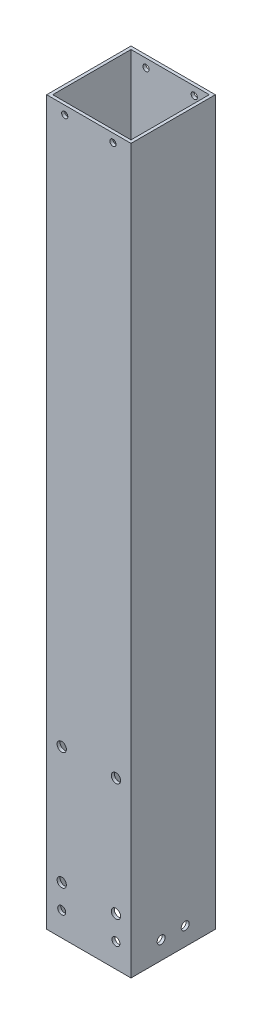
ISO-10303-21;
HEADER;
FILE_DESCRIPTION(('STEP AP214'),'2;1');
FILE_NAME('part.step','',(''),(''),'','','');
FILE_SCHEMA(('AUTOMOTIVE_DESIGN { 1 0 10303 214 1 1 1 1 }'));
ENDSEC;
DATA;
#1=APPLICATION_CONTEXT('core data for automotive mechanical design processes');
#2=APPLICATION_PROTOCOL_DEFINITION('international standard','automotive_design',2000,#1);
#3=PRODUCT_CONTEXT('',#1,'mechanical');
#4=PRODUCT('Part','Part','',(#3));
#5=PRODUCT_RELATED_PRODUCT_CATEGORY('part','',(#4));
#6=PRODUCT_DEFINITION_FORMATION('','',#4);
#7=PRODUCT_DEFINITION_CONTEXT('part definition',#1,'design');
#8=PRODUCT_DEFINITION('design','',#6,#7);
#9=PRODUCT_DEFINITION_SHAPE('','',#8);
#10=(LENGTH_UNIT() NAMED_UNIT(*) SI_UNIT(.MILLI.,.METRE.));
#11=(NAMED_UNIT(*) PLANE_ANGLE_UNIT() SI_UNIT($,.RADIAN.));
#12=(NAMED_UNIT(*) SI_UNIT($,.STERADIAN.) SOLID_ANGLE_UNIT());
#13=UNCERTAINTY_MEASURE_WITH_UNIT(LENGTH_MEASURE(1.E-05),#10,'distance_accuracy_value','');
#14=(GEOMETRIC_REPRESENTATION_CONTEXT(3) GLOBAL_UNCERTAINTY_ASSIGNED_CONTEXT((#13)) GLOBAL_UNIT_ASSIGNED_CONTEXT((#10,
#11,#12)) REPRESENTATION_CONTEXT('',''));
#15=CARTESIAN_POINT('',(0.,0.,0.));
#16=DIRECTION('',(0.,0.,1.));
#17=DIRECTION('',(1.,0.,0.));
#18=AXIS2_PLACEMENT_3D('',#15,#16,#17);
#19=CARTESIAN_POINT('',(0.,0.,0.));
#20=DIRECTION('',(0.,-1.,0.));
#21=DIRECTION('',(0.,0.,-1.));
#22=AXIS2_PLACEMENT_3D('',#19,#20,#21);
#23=PLANE('',#22);
#24=DIRECTION('',(-1.,0.,0.));
#25=VECTOR('',#24,1.);
#26=CARTESIAN_POINT('',(41.275,0.,-41.275));
#27=LINE('',#26,#25);
#28=CARTESIAN_POINT('',(41.275,0.,-41.275));
#29=VERTEX_POINT('',#28);
#30=CARTESIAN_POINT('',(7.78775142451272,0.,-41.275));
#31=VERTEX_POINT('',#30);
#32=EDGE_CURVE('E135',#29,#31,#27,.T.);
#33=ORIENTED_EDGE('',*,*,#32,.T.);
#34=DIRECTION('',(0.,0.,-1.));
#35=VECTOR('',#34,1.);
#36=CARTESIAN_POINT('',(7.78775142451273,0.,44.451));
#37=LINE('',#36,#35);
#38=CARTESIAN_POINT('',(7.78775142451272,0.,-44.45));
#39=VERTEX_POINT('',#38);
#40=EDGE_CURVE('E59',#31,#39,#37,.T.);
#41=ORIENTED_EDGE('',*,*,#40,.T.);
#42=DIRECTION('',(-1.,0.,0.));
#43=VECTOR('',#42,1.);
#44=CARTESIAN_POINT('',(44.45,0.,-44.45));
#45=LINE('',#44,#43);
#46=CARTESIAN_POINT('',(44.45,0.,-44.45));
#47=VERTEX_POINT('',#46);
#48=EDGE_CURVE('E133',#47,#39,#45,.T.);
#49=ORIENTED_EDGE('',*,*,#48,.F.);
#50=DIRECTION('',(0.,0.,-1.));
#51=VECTOR('',#50,1.);
#52=CARTESIAN_POINT('',(44.45,0.,-44.45));
#53=LINE('',#52,#51);
#54=CARTESIAN_POINT('',(44.45,0.,44.45));
#55=VERTEX_POINT('',#54);
#56=EDGE_CURVE('E149',#55,#47,#53,.T.);
#57=ORIENTED_EDGE('',*,*,#56,.F.);
#58=DIRECTION('',(1.,0.,0.));
#59=VECTOR('',#58,1.);
#60=CARTESIAN_POINT('',(44.45,0.,44.45));
#61=LINE('',#60,#59);
#62=CARTESIAN_POINT('',(-44.45,0.,44.45));
#63=VERTEX_POINT('',#62);
#64=EDGE_CURVE('E312',#63,#55,#61,.T.);
#65=ORIENTED_EDGE('',*,*,#64,.F.);
#66=DIRECTION('',(0.,0.,1.));
#67=VECTOR('',#66,1.);
#68=CARTESIAN_POINT('',(-44.45,0.,-44.45));
#69=LINE('',#68,#67);
#70=CARTESIAN_POINT('',(-44.45,0.,-44.45));
#71=VERTEX_POINT('',#70);
#72=EDGE_CURVE('E305',#71,#63,#69,.T.);
#73=ORIENTED_EDGE('',*,*,#72,.F.);
#74=CARTESIAN_POINT('',(-7.78775142451273,0.,-44.45));
#75=VERTEX_POINT('',#74);
#76=EDGE_CURVE('E144',#75,#71,#45,.T.);
#77=ORIENTED_EDGE('',*,*,#76,.F.);
#78=DIRECTION('',(0.,0.,-1.));
#79=VECTOR('',#78,1.);
#80=CARTESIAN_POINT('',(-7.78775142451272,0.,44.451));
#81=LINE('',#80,#79);
#82=CARTESIAN_POINT('',(-7.78775142451273,0.,-41.275));
#83=VERTEX_POINT('',#82);
#84=EDGE_CURVE('E122',#75,#83,#81,.F.);
#85=ORIENTED_EDGE('',*,*,#84,.T.);
#86=CARTESIAN_POINT('',(-41.275,0.,-41.275));
#87=VERTEX_POINT('',#86);
#88=EDGE_CURVE('E296',#83,#87,#27,.T.);
#89=ORIENTED_EDGE('',*,*,#88,.T.);
#90=DIRECTION('',(0.,0.,1.));
#91=VECTOR('',#90,1.);
#92=CARTESIAN_POINT('',(-41.275,0.,41.275));
#93=LINE('',#92,#91);
#94=CARTESIAN_POINT('',(-41.275,0.,41.275));
#95=VERTEX_POINT('',#94);
#96=EDGE_CURVE('E279',#87,#95,#93,.T.);
#97=ORIENTED_EDGE('',*,*,#96,.T.);
#98=DIRECTION('',(1.,0.,0.));
#99=VECTOR('',#98,1.);
#100=CARTESIAN_POINT('',(41.275,0.,41.275));
#101=LINE('',#100,#99);
#102=CARTESIAN_POINT('',(41.275,0.,41.275));
#103=VERTEX_POINT('',#102);
#104=EDGE_CURVE('E291',#95,#103,#101,.T.);
#105=ORIENTED_EDGE('',*,*,#104,.T.);
#106=DIRECTION('',(0.,0.,-1.));
#107=VECTOR('',#106,1.);
#108=CARTESIAN_POINT('',(41.275,0.,41.275));
#109=LINE('',#108,#107);
#110=EDGE_CURVE('E294',#103,#29,#109,.T.);
#111=ORIENTED_EDGE('',*,*,#110,.T.);
#112=EDGE_LOOP('',(#33,#41,#49,#57,#65,#73,#77,#85,#89,#97,#105,#111));
#113=FACE_BOUND('',#112,.T.);
#114=ADVANCED_FACE('F42',(#113),#23,.T.);
#115=CARTESIAN_POINT('',(44.45,762.,-44.45));
#116=DIRECTION('',(0.,0.,1.));
#117=DIRECTION('',(1.,0.,0.));
#118=AXIS2_PLACEMENT_3D('',#115,#116,#117);
#119=PLANE('',#118);
#120=CARTESIAN_POINT('',(25.4,753.11,-44.45));
#121=DIRECTION('',(0.,0.,-1.));
#122=DIRECTION('',(-1.,0.,0.));
#123=AXIS2_PLACEMENT_3D('',#120,#121,#122);
#124=CIRCLE('',#123,3.26389999999999);
#125=CARTESIAN_POINT('',(22.1361,753.11,-44.45));
#126=VERTEX_POINT('',#125);
#127=EDGE_CURVE('E660',#126,#126,#124,.T.);
#128=ORIENTED_EDGE('',*,*,#127,.F.);
#129=EDGE_LOOP('',(#128));
#130=FACE_BOUND('',#129,.T.);
#131=CARTESIAN_POINT('',(-25.4,753.11,-44.45));
#132=DIRECTION('',(0.,0.,-1.));
#133=DIRECTION('',(-1.,0.,0.));
#134=AXIS2_PLACEMENT_3D('',#131,#132,#133);
#135=CIRCLE('',#134,3.26389999999999);
#136=CARTESIAN_POINT('',(-28.6639,753.11,-44.45));
#137=VERTEX_POINT('',#136);
#138=EDGE_CURVE('E206',#137,#137,#135,.T.);
#139=ORIENTED_EDGE('',*,*,#138,.F.);
#140=EDGE_LOOP('',(#139));
#141=FACE_BOUND('',#140,.T.);
#142=CARTESIAN_POINT('',(0.,383.9845,-44.45));
#143=DIRECTION('',(0.,0.,-1.));
#144=DIRECTION('',(-1.,0.,0.));
#145=AXIS2_PLACEMENT_3D('',#142,#143,#144);
#146=CIRCLE('',#145,7.93749999999999);
#147=CARTESIAN_POINT('',(-7.9375,383.9845,-44.45));
#148=VERTEX_POINT('',#147);
#149=EDGE_CURVE('E196',#148,#148,#146,.T.);
#150=ORIENTED_EDGE('',*,*,#149,.F.);
#151=EDGE_LOOP('',(#150));
#152=FACE_BOUND('',#151,.T.);
#153=CARTESIAN_POINT('',(28.575,50.8,-44.45));
#154=DIRECTION('',(0.,0.,-1.));
#155=DIRECTION('',(-1.,0.,0.));
#156=AXIS2_PLACEMENT_3D('',#153,#154,#155);
#157=CIRCLE('',#156,4.90219999999999);
#158=CARTESIAN_POINT('',(23.6728,50.8,-44.45));
#159=VERTEX_POINT('',#158);
#160=EDGE_CURVE('E195',#159,#159,#157,.T.);
#161=ORIENTED_EDGE('',*,*,#160,.F.);
#162=EDGE_LOOP('',(#161));
#163=FACE_BOUND('',#162,.T.);
#164=CARTESIAN_POINT('',(-28.575,50.8,-44.45));
#165=DIRECTION('',(0.,0.,-1.));
#166=DIRECTION('',(-1.,0.,0.));
#167=AXIS2_PLACEMENT_3D('',#164,#165,#166);
#168=CIRCLE('',#167,4.90219999999999);
#169=CARTESIAN_POINT('',(-33.4772,50.8,-44.45));
#170=VERTEX_POINT('',#169);
#171=EDGE_CURVE('E223',#170,#170,#168,.T.);
#172=ORIENTED_EDGE('',*,*,#171,.F.);
#173=EDGE_LOOP('',(#172));
#174=FACE_BOUND('',#173,.T.);
#175=CARTESIAN_POINT('',(-28.575,174.625,-44.45));
#176=DIRECTION('',(0.,0.,-1.));
#177=DIRECTION('',(-1.,0.,0.));
#178=AXIS2_PLACEMENT_3D('',#175,#176,#177);
#179=CIRCLE('',#178,4.90219999999999);
#180=CARTESIAN_POINT('',(-33.4772,174.625,-44.45));
#181=VERTEX_POINT('',#180);
#182=EDGE_CURVE('E235',#181,#181,#179,.T.);
#183=ORIENTED_EDGE('',*,*,#182,.F.);
#184=EDGE_LOOP('',(#183));
#185=FACE_BOUND('',#184,.T.);
#186=CARTESIAN_POINT('',(28.575,174.625,-44.45));
#187=DIRECTION('',(0.,0.,-1.));
#188=DIRECTION('',(-1.,0.,0.));
#189=AXIS2_PLACEMENT_3D('',#186,#187,#188);
#190=CIRCLE('',#189,4.90219999999999);
#191=CARTESIAN_POINT('',(23.6728,174.625,-44.45));
#192=VERTEX_POINT('',#191);
#193=EDGE_CURVE('E242',#192,#192,#190,.T.);
#194=ORIENTED_EDGE('',*,*,#193,.F.);
#195=EDGE_LOOP('',(#194));
#196=FACE_BOUND('',#195,.T.);
#197=CARTESIAN_POINT('',(28.575,25.4,-44.45));
#198=DIRECTION('',(0.,0.,1.));
#199=DIRECTION('',(1.,0.,0.));
#200=AXIS2_PLACEMENT_3D('',#197,#198,#199);
#201=CIRCLE('',#200,4.2164);
#202=CARTESIAN_POINT('',(32.7914,25.4,-44.45));
#203=VERTEX_POINT('',#202);
#204=EDGE_CURVE('E264',#203,#203,#201,.T.);
#205=ORIENTED_EDGE('',*,*,#204,.T.);
#206=EDGE_LOOP('',(#205));
#207=FACE_BOUND('',#206,.T.);
#208=CARTESIAN_POINT('',(-28.575,25.4,-44.45));
#209=DIRECTION('',(0.,0.,1.));
#210=DIRECTION('',(1.,0.,0.));
#211=AXIS2_PLACEMENT_3D('',#208,#209,#210);
#212=CIRCLE('',#211,4.2164);
#213=CARTESIAN_POINT('',(-24.3586,25.4,-44.45));
#214=VERTEX_POINT('',#213);
#215=EDGE_CURVE('E164',#214,#214,#212,.T.);
#216=ORIENTED_EDGE('',*,*,#215,.T.);
#217=EDGE_LOOP('',(#216));
#218=FACE_BOUND('',#217,.T.);
#219=CARTESIAN_POINT('',(0.,-2.54,-44.45));
#220=DIRECTION('',(0.,0.,1.));
#221=DIRECTION('',(1.,0.,0.));
#222=AXIS2_PLACEMENT_3D('',#219,#220,#221);
#223=CIRCLE('',#222,8.1915);
#224=EDGE_CURVE('E119',#75,#39,#223,.F.);
#225=ORIENTED_EDGE('',*,*,#224,.F.);
#226=ORIENTED_EDGE('',*,*,#76,.T.);
#227=DIRECTION('',(0.,-1.,0.));
#228=VECTOR('',#227,1.);
#229=CARTESIAN_POINT('',(-44.45,762.,-44.45));
#230=LINE('',#229,#228);
#231=CARTESIAN_POINT('',(-44.45,762.,-44.45));
#232=VERTEX_POINT('',#231);
#233=EDGE_CURVE('E153',#232,#71,#230,.T.);
#234=ORIENTED_EDGE('',*,*,#233,.F.);
#235=DIRECTION('',(-1.,0.,0.));
#236=VECTOR('',#235,1.);
#237=CARTESIAN_POINT('',(44.45,762.,-44.45));
#238=LINE('',#237,#236);
#239=CARTESIAN_POINT('',(44.45,762.,-44.45));
#240=VERTEX_POINT('',#239);
#241=EDGE_CURVE('E156',#240,#232,#238,.T.);
#242=ORIENTED_EDGE('',*,*,#241,.F.);
#243=DIRECTION('',(0.,-1.,0.));
#244=VECTOR('',#243,1.);
#245=CARTESIAN_POINT('',(44.45,762.,-44.45));
#246=LINE('',#245,#244);
#247=EDGE_CURVE('E142',#240,#47,#246,.T.);
#248=ORIENTED_EDGE('',*,*,#247,.T.);
#249=ORIENTED_EDGE('',*,*,#48,.T.);
#250=EDGE_LOOP('',(#225,#226,#234,#242,#248,#249));
#251=FACE_BOUND('',#250,.T.);
#252=ADVANCED_FACE('F139',(#130,#141,#152,#163,#174,#185,#196,#207,#218,#251),#119,.F.);
#253=CARTESIAN_POINT('',(41.275,762.,-41.275));
#254=DIRECTION('',(0.,0.,1.));
#255=DIRECTION('',(1.,0.,0.));
#256=AXIS2_PLACEMENT_3D('',#253,#254,#255);
#257=PLANE('',#256);
#258=CARTESIAN_POINT('',(25.4,753.11,-41.275));
#259=DIRECTION('',(0.,0.,1.));
#260=DIRECTION('',(1.,0.,0.));
#261=AXIS2_PLACEMENT_3D('',#258,#259,#260);
#262=CIRCLE('',#261,3.26389999999998);
#263=CARTESIAN_POINT('',(28.6639,753.11,-41.275));
#264=VERTEX_POINT('',#263);
#265=EDGE_CURVE('E211',#264,#264,#262,.T.);
#266=ORIENTED_EDGE('',*,*,#265,.F.);
#267=EDGE_LOOP('',(#266));
#268=FACE_BOUND('',#267,.T.);
#269=CARTESIAN_POINT('',(-25.4,753.11,-41.275));
#270=DIRECTION('',(0.,0.,1.));
#271=DIRECTION('',(1.,0.,0.));
#272=AXIS2_PLACEMENT_3D('',#269,#270,#271);
#273=CIRCLE('',#272,3.26389999999998);
#274=CARTESIAN_POINT('',(-22.1361,753.11,-41.275));
#275=VERTEX_POINT('',#274);
#276=EDGE_CURVE('E199',#275,#275,#273,.T.);
#277=ORIENTED_EDGE('',*,*,#276,.F.);
#278=EDGE_LOOP('',(#277));
#279=FACE_BOUND('',#278,.T.);
#280=CARTESIAN_POINT('',(0.,383.9845,-41.275));
#281=DIRECTION('',(0.,0.,1.));
#282=DIRECTION('',(1.,0.,0.));
#283=AXIS2_PLACEMENT_3D('',#280,#281,#282);
#284=CIRCLE('',#283,7.93749999999999);
#285=CARTESIAN_POINT('',(7.93749999999999,383.9845,-41.275));
#286=VERTEX_POINT('',#285);
#287=EDGE_CURVE('E193',#286,#286,#284,.T.);
#288=ORIENTED_EDGE('',*,*,#287,.F.);
#289=EDGE_LOOP('',(#288));
#290=FACE_BOUND('',#289,.T.);
#291=CARTESIAN_POINT('',(28.575,50.8,-41.275));
#292=DIRECTION('',(0.,0.,1.));
#293=DIRECTION('',(1.,0.,0.));
#294=AXIS2_PLACEMENT_3D('',#291,#292,#293);
#295=CIRCLE('',#294,4.90219999999998);
#296=CARTESIAN_POINT('',(33.4772,50.8,-41.275));
#297=VERTEX_POINT('',#296);
#298=EDGE_CURVE('E191',#297,#297,#295,.T.);
#299=ORIENTED_EDGE('',*,*,#298,.F.);
#300=EDGE_LOOP('',(#299));
#301=FACE_BOUND('',#300,.T.);
#302=CARTESIAN_POINT('',(-28.575,50.8,-41.275));
#303=DIRECTION('',(0.,0.,1.));
#304=DIRECTION('',(1.,0.,0.));
#305=AXIS2_PLACEMENT_3D('',#302,#303,#304);
#306=CIRCLE('',#305,4.90219999999998);
#307=CARTESIAN_POINT('',(-23.6728,50.8,-41.275));
#308=VERTEX_POINT('',#307);
#309=EDGE_CURVE('E232',#308,#308,#306,.T.);
#310=ORIENTED_EDGE('',*,*,#309,.F.);
#311=EDGE_LOOP('',(#310));
#312=FACE_BOUND('',#311,.T.);
#313=CARTESIAN_POINT('',(-28.575,174.625,-41.275));
#314=DIRECTION('',(0.,0.,1.));
#315=DIRECTION('',(1.,0.,0.));
#316=AXIS2_PLACEMENT_3D('',#313,#314,#315);
#317=CIRCLE('',#316,4.90219999999998);
#318=CARTESIAN_POINT('',(-23.6728,174.625,-41.275));
#319=VERTEX_POINT('',#318);
#320=EDGE_CURVE('E186',#319,#319,#317,.T.);
#321=ORIENTED_EDGE('',*,*,#320,.F.);
#322=EDGE_LOOP('',(#321));
#323=FACE_BOUND('',#322,.T.);
#324=CARTESIAN_POINT('',(28.575,174.625,-41.275));
#325=DIRECTION('',(0.,0.,1.));
#326=DIRECTION('',(1.,0.,0.));
#327=AXIS2_PLACEMENT_3D('',#324,#325,#326);
#328=CIRCLE('',#327,4.90219999999998);
#329=CARTESIAN_POINT('',(33.4772,174.625,-41.275));
#330=VERTEX_POINT('',#329);
#331=EDGE_CURVE('E136',#330,#330,#328,.T.);
#332=ORIENTED_EDGE('',*,*,#331,.F.);
#333=EDGE_LOOP('',(#332));
#334=FACE_BOUND('',#333,.T.);
#335=CARTESIAN_POINT('',(-28.575,25.4,-41.275));
#336=DIRECTION('',(0.,0.,1.));
#337=DIRECTION('',(1.,0.,0.));
#338=AXIS2_PLACEMENT_3D('',#335,#336,#337);
#339=CIRCLE('',#338,4.2164);
#340=CARTESIAN_POINT('',(-24.3586,25.4,-41.275));
#341=VERTEX_POINT('',#340);
#342=EDGE_CURVE('E165',#341,#341,#339,.T.);
#343=ORIENTED_EDGE('',*,*,#342,.F.);
#344=EDGE_LOOP('',(#343));
#345=FACE_BOUND('',#344,.T.);
#346=CARTESIAN_POINT('',(28.575,25.4,-41.275));
#347=DIRECTION('',(0.,0.,1.));
#348=DIRECTION('',(1.,0.,0.));
#349=AXIS2_PLACEMENT_3D('',#346,#347,#348);
#350=CIRCLE('',#349,4.2164);
#351=CARTESIAN_POINT('',(32.7914,25.4,-41.275));
#352=VERTEX_POINT('',#351);
#353=EDGE_CURVE('E160',#352,#352,#350,.T.);
#354=ORIENTED_EDGE('',*,*,#353,.F.);
#355=EDGE_LOOP('',(#354));
#356=FACE_BOUND('',#355,.T.);
#357=ORIENTED_EDGE('',*,*,#88,.F.);
#358=CARTESIAN_POINT('',(0.,-2.54,-41.275));
#359=DIRECTION('',(0.,0.,1.));
#360=DIRECTION('',(1.,0.,0.));
#361=AXIS2_PLACEMENT_3D('',#358,#359,#360);
#362=CIRCLE('',#361,8.1915);
#363=EDGE_CURVE('E127',#83,#31,#362,.F.);
#364=ORIENTED_EDGE('',*,*,#363,.T.);
#365=ORIENTED_EDGE('',*,*,#32,.F.);
#366=DIRECTION('',(0.,-1.,0.));
#367=VECTOR('',#366,1.);
#368=CARTESIAN_POINT('',(41.275,762.,-41.275));
#369=LINE('',#368,#367);
#370=CARTESIAN_POINT('',(41.275,762.,-41.275));
#371=VERTEX_POINT('',#370);
#372=EDGE_CURVE('E67',#371,#29,#369,.T.);
#373=ORIENTED_EDGE('',*,*,#372,.F.);
#374=DIRECTION('',(-1.,0.,0.));
#375=VECTOR('',#374,1.);
#376=CARTESIAN_POINT('',(41.275,762.,-41.275));
#377=LINE('',#376,#375);
#378=CARTESIAN_POINT('',(-41.275,762.,-41.275));
#379=VERTEX_POINT('',#378);
#380=EDGE_CURVE('E286',#371,#379,#377,.T.);
#381=ORIENTED_EDGE('',*,*,#380,.T.);
#382=DIRECTION('',(0.,-1.,0.));
#383=VECTOR('',#382,1.);
#384=CARTESIAN_POINT('',(-41.275,762.,-41.275));
#385=LINE('',#384,#383);
#386=EDGE_CURVE('E288',#379,#87,#385,.T.);
#387=ORIENTED_EDGE('',*,*,#386,.T.);
#388=EDGE_LOOP('',(#357,#364,#365,#373,#381,#387));
#389=FACE_BOUND('',#388,.T.);
#390=ADVANCED_FACE('F326',(#268,#279,#290,#301,#312,#323,#334,#345,#356,#389),#257,.T.);
#391=CARTESIAN_POINT('',(0.,762.,0.));
#392=DIRECTION('',(0.,-1.,0.));
#393=DIRECTION('',(0.,0.,-1.));
#394=AXIS2_PLACEMENT_3D('',#391,#392,#393);
#395=PLANE('',#394);
#396=DIRECTION('',(0.,0.,1.));
#397=VECTOR('',#396,1.);
#398=CARTESIAN_POINT('',(-44.45,762.,-44.45));
#399=LINE('',#398,#397);
#400=CARTESIAN_POINT('',(-44.45,762.,44.45));
#401=VERTEX_POINT('',#400);
#402=EDGE_CURVE('E143',#232,#401,#399,.T.);
#403=ORIENTED_EDGE('',*,*,#402,.T.);
#404=DIRECTION('',(1.,0.,0.));
#405=VECTOR('',#404,1.);
#406=CARTESIAN_POINT('',(44.45,762.,44.45));
#407=LINE('',#406,#405);
#408=CARTESIAN_POINT('',(44.45,762.,44.45));
#409=VERTEX_POINT('',#408);
#410=EDGE_CURVE('E147',#401,#409,#407,.T.);
#411=ORIENTED_EDGE('',*,*,#410,.T.);
#412=DIRECTION('',(0.,0.,-1.));
#413=VECTOR('',#412,1.);
#414=CARTESIAN_POINT('',(44.45,762.,-44.45));
#415=LINE('',#414,#413);
#416=EDGE_CURVE('E308',#409,#240,#415,.T.);
#417=ORIENTED_EDGE('',*,*,#416,.T.);
#418=ORIENTED_EDGE('',*,*,#241,.T.);
#419=EDGE_LOOP('',(#403,#411,#417,#418));
#420=FACE_BOUND('',#419,.T.);
#421=DIRECTION('',(0.,0.,1.));
#422=VECTOR('',#421,1.);
#423=CARTESIAN_POINT('',(-41.275,762.,41.275));
#424=LINE('',#423,#422);
#425=CARTESIAN_POINT('',(-41.275,762.,41.275));
#426=VERTEX_POINT('',#425);
#427=EDGE_CURVE('E280',#379,#426,#424,.T.);
#428=ORIENTED_EDGE('',*,*,#427,.F.);
#429=ORIENTED_EDGE('',*,*,#380,.F.);
#430=DIRECTION('',(0.,0.,-1.));
#431=VECTOR('',#430,1.);
#432=CARTESIAN_POINT('',(41.275,762.,41.275));
#433=LINE('',#432,#431);
#434=CARTESIAN_POINT('',(41.275,762.,41.275));
#435=VERTEX_POINT('',#434);
#436=EDGE_CURVE('E284',#435,#371,#433,.T.);
#437=ORIENTED_EDGE('',*,*,#436,.F.);
#438=DIRECTION('',(1.,0.,0.));
#439=VECTOR('',#438,1.);
#440=CARTESIAN_POINT('',(41.275,762.,41.275));
#441=LINE('',#440,#439);
#442=EDGE_CURVE('E282',#426,#435,#441,.T.);
#443=ORIENTED_EDGE('',*,*,#442,.F.);
#444=EDGE_LOOP('',(#428,#429,#437,#443));
#445=FACE_BOUND('',#444,.T.);
#446=ADVANCED_FACE('F335',(#420,#445),#395,.F.);
#447=CARTESIAN_POINT('',(-44.45,762.,-44.45));
#448=DIRECTION('',(1.,0.,0.));
#449=DIRECTION('',(0.,0.,-1.));
#450=AXIS2_PLACEMENT_3D('',#447,#448,#449);
#451=PLANE('',#450);
#452=CARTESIAN_POINT('',(-44.45,19.05,12.7));
#453=DIRECTION('',(1.,0.,0.));
#454=DIRECTION('',(0.,0.,-1.));
#455=AXIS2_PLACEMENT_3D('',#452,#453,#454);
#456=CIRCLE('',#455,4.21639999999999);
#457=CARTESIAN_POINT('',(-44.45,19.05,8.48360000000001));
#458=VERTEX_POINT('',#457);
#459=EDGE_CURVE('E261',#458,#458,#456,.T.);
#460=ORIENTED_EDGE('',*,*,#459,.T.);
#461=EDGE_LOOP('',(#460));
#462=FACE_BOUND('',#461,.T.);
#463=CARTESIAN_POINT('',(-44.45,19.05,-12.7));
#464=DIRECTION('',(1.,0.,0.));
#465=DIRECTION('',(0.,0.,-1.));
#466=AXIS2_PLACEMENT_3D('',#463,#464,#465);
#467=CIRCLE('',#466,4.21639999999999);
#468=CARTESIAN_POINT('',(-44.45,19.05,-16.9164));
#469=VERTEX_POINT('',#468);
#470=EDGE_CURVE('E178',#469,#469,#467,.T.);
#471=ORIENTED_EDGE('',*,*,#470,.T.);
#472=EDGE_LOOP('',(#471));
#473=FACE_BOUND('',#472,.T.);
#474=ORIENTED_EDGE('',*,*,#72,.T.);
#475=DIRECTION('',(0.,-1.,0.));
#476=VECTOR('',#475,1.);
#477=CARTESIAN_POINT('',(-44.45,762.,44.45));
#478=LINE('',#477,#476);
#479=EDGE_CURVE('E11',#401,#63,#478,.T.);
#480=ORIENTED_EDGE('',*,*,#479,.F.);
#481=ORIENTED_EDGE('',*,*,#402,.F.);
#482=ORIENTED_EDGE('',*,*,#233,.T.);
#483=EDGE_LOOP('',(#474,#480,#481,#482));
#484=FACE_BOUND('',#483,.T.);
#485=ADVANCED_FACE('F44',(#462,#473,#484),#451,.F.);
#486=CARTESIAN_POINT('',(44.45,762.,44.45));
#487=DIRECTION('',(0.,0.,-1.));
#488=DIRECTION('',(-1.,0.,0.));
#489=AXIS2_PLACEMENT_3D('',#486,#487,#488);
#490=PLANE('',#489);
#491=CARTESIAN_POINT('',(25.4,753.11,44.45));
#492=DIRECTION('',(0.,0.,-1.));
#493=DIRECTION('',(-1.,0.,0.));
#494=AXIS2_PLACEMENT_3D('',#491,#492,#493);
#495=CIRCLE('',#494,3.26389999999998);
#496=CARTESIAN_POINT('',(22.1361,753.11,44.45));
#497=VERTEX_POINT('',#496);
#498=EDGE_CURVE('E385',#497,#497,#495,.T.);
#499=ORIENTED_EDGE('',*,*,#498,.T.);
#500=EDGE_LOOP('',(#499));
#501=FACE_BOUND('',#500,.T.);
#502=CARTESIAN_POINT('',(-25.4,753.11,44.45));
#503=DIRECTION('',(0.,0.,-1.));
#504=DIRECTION('',(-1.,0.,0.));
#505=AXIS2_PLACEMENT_3D('',#502,#503,#504);
#506=CIRCLE('',#505,3.26389999999998);
#507=CARTESIAN_POINT('',(-28.6639,753.11,44.45));
#508=VERTEX_POINT('',#507);
#509=EDGE_CURVE('E200',#508,#508,#506,.T.);
#510=ORIENTED_EDGE('',*,*,#509,.T.);
#511=EDGE_LOOP('',(#510));
#512=FACE_BOUND('',#511,.T.);
#513=CARTESIAN_POINT('',(28.575,50.8,44.45));
#514=DIRECTION('',(0.,0.,-1.));
#515=DIRECTION('',(-1.,0.,0.));
#516=AXIS2_PLACEMENT_3D('',#513,#514,#515);
#517=CIRCLE('',#516,4.90219999999997);
#518=CARTESIAN_POINT('',(23.6728,50.8,44.45));
#519=VERTEX_POINT('',#518);
#520=EDGE_CURVE('E192',#519,#519,#517,.T.);
#521=ORIENTED_EDGE('',*,*,#520,.T.);
#522=EDGE_LOOP('',(#521));
#523=FACE_BOUND('',#522,.T.);
#524=CARTESIAN_POINT('',(-28.575,50.8,44.45));
#525=DIRECTION('',(0.,0.,-1.));
#526=DIRECTION('',(-1.,0.,0.));
#527=AXIS2_PLACEMENT_3D('',#524,#525,#526);
#528=CIRCLE('',#527,4.90219999999998);
#529=CARTESIAN_POINT('',(-33.4772,50.8,44.45));
#530=VERTEX_POINT('',#529);
#531=EDGE_CURVE('E226',#530,#530,#528,.T.);
#532=ORIENTED_EDGE('',*,*,#531,.T.);
#533=EDGE_LOOP('',(#532));
#534=FACE_BOUND('',#533,.T.);
#535=CARTESIAN_POINT('',(-28.575,174.625,44.45));
#536=DIRECTION('',(0.,0.,-1.));
#537=DIRECTION('',(-1.,0.,0.));
#538=AXIS2_PLACEMENT_3D('',#535,#536,#537);
#539=CIRCLE('',#538,4.90219999999998);
#540=CARTESIAN_POINT('',(-33.4772,174.625,44.45));
#541=VERTEX_POINT('',#540);
#542=EDGE_CURVE('E187',#541,#541,#539,.T.);
#543=ORIENTED_EDGE('',*,*,#542,.T.);
#544=EDGE_LOOP('',(#543));
#545=FACE_BOUND('',#544,.T.);
#546=CARTESIAN_POINT('',(28.575,174.625,44.45));
#547=DIRECTION('',(0.,0.,-1.));
#548=DIRECTION('',(-1.,0.,0.));
#549=AXIS2_PLACEMENT_3D('',#546,#547,#548);
#550=CIRCLE('',#549,4.90219999999997);
#551=CARTESIAN_POINT('',(23.6728,174.625,44.45));
#552=VERTEX_POINT('',#551);
#553=EDGE_CURVE('E182',#552,#552,#550,.T.);
#554=ORIENTED_EDGE('',*,*,#553,.T.);
#555=EDGE_LOOP('',(#554));
#556=FACE_BOUND('',#555,.T.);
#557=CARTESIAN_POINT('',(-28.575,25.4,44.45));
#558=DIRECTION('',(0.,0.,1.));
#559=DIRECTION('',(1.,0.,0.));
#560=AXIS2_PLACEMENT_3D('',#557,#558,#559);
#561=CIRCLE('',#560,4.2164);
#562=CARTESIAN_POINT('',(-24.3586,25.4,44.45));
#563=VERTEX_POINT('',#562);
#564=EDGE_CURVE('E265',#563,#563,#561,.T.);
#565=ORIENTED_EDGE('',*,*,#564,.F.);
#566=EDGE_LOOP('',(#565));
#567=FACE_BOUND('',#566,.T.);
#568=CARTESIAN_POINT('',(28.575,25.4,44.45));
#569=DIRECTION('',(0.,0.,1.));
#570=DIRECTION('',(1.,0.,0.));
#571=AXIS2_PLACEMENT_3D('',#568,#569,#570);
#572=CIRCLE('',#571,4.2164);
#573=CARTESIAN_POINT('',(32.7914,25.4,44.45));
#574=VERTEX_POINT('',#573);
#575=EDGE_CURVE('E268',#574,#574,#572,.T.);
#576=ORIENTED_EDGE('',*,*,#575,.F.);
#577=EDGE_LOOP('',(#576));
#578=FACE_BOUND('',#577,.T.);
#579=ORIENTED_EDGE('',*,*,#64,.T.);
#580=DIRECTION('',(0.,-1.,0.));
#581=VECTOR('',#580,1.);
#582=CARTESIAN_POINT('',(44.45,762.,44.45));
#583=LINE('',#582,#581);
#584=EDGE_CURVE('E51',#409,#55,#583,.T.);
#585=ORIENTED_EDGE('',*,*,#584,.F.);
#586=ORIENTED_EDGE('',*,*,#410,.F.);
#587=ORIENTED_EDGE('',*,*,#479,.T.);
#588=EDGE_LOOP('',(#579,#585,#586,#587));
#589=FACE_BOUND('',#588,.T.);
#590=ADVANCED_FACE('F320',(#501,#512,#523,#534,#545,#556,#567,#578,#589),#490,.F.);
#591=CARTESIAN_POINT('',(44.45,762.,-44.45));
#592=DIRECTION('',(-1.,0.,0.));
#593=DIRECTION('',(0.,0.,1.));
#594=AXIS2_PLACEMENT_3D('',#591,#592,#593);
#595=PLANE('',#594);
#596=CARTESIAN_POINT('',(44.45,19.05,12.7));
#597=DIRECTION('',(-1.,0.,0.));
#598=DIRECTION('',(0.,0.,1.));
#599=AXIS2_PLACEMENT_3D('',#596,#597,#598);
#600=CIRCLE('',#599,4.21639999999999);
#601=CARTESIAN_POINT('',(44.45,19.05,16.9164));
#602=VERTEX_POINT('',#601);
#603=EDGE_CURVE('E173',#602,#602,#600,.T.);
#604=ORIENTED_EDGE('',*,*,#603,.T.);
#605=EDGE_LOOP('',(#604));
#606=FACE_BOUND('',#605,.T.);
#607=CARTESIAN_POINT('',(44.45,19.05,-12.7));
#608=DIRECTION('',(-1.,0.,0.));
#609=DIRECTION('',(0.,0.,1.));
#610=AXIS2_PLACEMENT_3D('',#607,#608,#609);
#611=CIRCLE('',#610,4.21639999999999);
#612=CARTESIAN_POINT('',(44.45,19.05,-8.48360000000001));
#613=VERTEX_POINT('',#612);
#614=EDGE_CURVE('E126',#613,#613,#611,.T.);
#615=ORIENTED_EDGE('',*,*,#614,.T.);
#616=EDGE_LOOP('',(#615));
#617=FACE_BOUND('',#616,.T.);
#618=ORIENTED_EDGE('',*,*,#56,.T.);
#619=ORIENTED_EDGE('',*,*,#247,.F.);
#620=ORIENTED_EDGE('',*,*,#416,.F.);
#621=ORIENTED_EDGE('',*,*,#584,.T.);
#622=EDGE_LOOP('',(#618,#619,#620,#621));
#623=FACE_BOUND('',#622,.T.);
#624=ADVANCED_FACE('F316',(#606,#617,#623),#595,.F.);
#625=CARTESIAN_POINT('',(-41.275,762.,41.275));
#626=DIRECTION('',(1.,0.,0.));
#627=DIRECTION('',(0.,0.,-1.));
#628=AXIS2_PLACEMENT_3D('',#625,#626,#627);
#629=PLANE('',#628);
#630=CARTESIAN_POINT('',(-41.275,19.05,12.7));
#631=DIRECTION('',(1.,0.,0.));
#632=DIRECTION('',(0.,0.,-1.));
#633=AXIS2_PLACEMENT_3D('',#630,#631,#632);
#634=CIRCLE('',#633,4.21639999999999);
#635=CARTESIAN_POINT('',(-41.275,19.05,8.48360000000001));
#636=VERTEX_POINT('',#635);
#637=EDGE_CURVE('E177',#636,#636,#634,.T.);
#638=ORIENTED_EDGE('',*,*,#637,.F.);
#639=EDGE_LOOP('',(#638));
#640=FACE_BOUND('',#639,.T.);
#641=CARTESIAN_POINT('',(-41.275,19.05,-12.7));
#642=DIRECTION('',(1.,0.,0.));
#643=DIRECTION('',(0.,0.,-1.));
#644=AXIS2_PLACEMENT_3D('',#641,#642,#643);
#645=CIRCLE('',#644,4.21639999999999);
#646=CARTESIAN_POINT('',(-41.275,19.05,-16.9164));
#647=VERTEX_POINT('',#646);
#648=EDGE_CURVE('E172',#647,#647,#645,.T.);
#649=ORIENTED_EDGE('',*,*,#648,.F.);
#650=EDGE_LOOP('',(#649));
#651=FACE_BOUND('',#650,.T.);
#652=ORIENTED_EDGE('',*,*,#96,.F.);
#653=ORIENTED_EDGE('',*,*,#386,.F.);
#654=ORIENTED_EDGE('',*,*,#427,.T.);
#655=DIRECTION('',(0.,-1.,0.));
#656=VECTOR('',#655,1.);
#657=CARTESIAN_POINT('',(-41.275,762.,41.275));
#658=LINE('',#657,#656);
#659=EDGE_CURVE('E303',#426,#95,#658,.T.);
#660=ORIENTED_EDGE('',*,*,#659,.T.);
#661=EDGE_LOOP('',(#652,#653,#654,#660));
#662=FACE_BOUND('',#661,.T.);
#663=ADVANCED_FACE('F331',(#640,#651,#662),#629,.T.);
#664=CARTESIAN_POINT('',(41.275,762.,41.275));
#665=DIRECTION('',(0.,0.,-1.));
#666=DIRECTION('',(-1.,0.,0.));
#667=AXIS2_PLACEMENT_3D('',#664,#665,#666);
#668=PLANE('',#667);
#669=CARTESIAN_POINT('',(25.4,753.11,41.275));
#670=DIRECTION('',(0.,0.,-1.));
#671=DIRECTION('',(-1.,0.,0.));
#672=AXIS2_PLACEMENT_3D('',#669,#670,#671);
#673=CIRCLE('',#672,3.26389999999998);
#674=CARTESIAN_POINT('',(22.1361,753.11,41.275));
#675=VERTEX_POINT('',#674);
#676=EDGE_CURVE('E46',#675,#675,#673,.T.);
#677=ORIENTED_EDGE('',*,*,#676,.F.);
#678=EDGE_LOOP('',(#677));
#679=FACE_BOUND('',#678,.T.);
#680=CARTESIAN_POINT('',(-25.4,753.11,41.275));
#681=DIRECTION('',(0.,0.,-1.));
#682=DIRECTION('',(-1.,0.,0.));
#683=AXIS2_PLACEMENT_3D('',#680,#681,#682);
#684=CIRCLE('',#683,3.26389999999998);
#685=CARTESIAN_POINT('',(-28.6639,753.11,41.275));
#686=VERTEX_POINT('',#685);
#687=EDGE_CURVE('E197',#686,#686,#684,.T.);
#688=ORIENTED_EDGE('',*,*,#687,.F.);
#689=EDGE_LOOP('',(#688));
#690=FACE_BOUND('',#689,.T.);
#691=CARTESIAN_POINT('',(28.575,50.8,41.275));
#692=DIRECTION('',(0.,0.,-1.));
#693=DIRECTION('',(-1.,0.,0.));
#694=AXIS2_PLACEMENT_3D('',#691,#692,#693);
#695=CIRCLE('',#694,4.90219999999998);
#696=CARTESIAN_POINT('',(23.6728,50.8,41.275));
#697=VERTEX_POINT('',#696);
#698=EDGE_CURVE('E188',#697,#697,#695,.T.);
#699=ORIENTED_EDGE('',*,*,#698,.F.);
#700=EDGE_LOOP('',(#699));
#701=FACE_BOUND('',#700,.T.);
#702=CARTESIAN_POINT('',(-28.575,50.8,41.275));
#703=DIRECTION('',(0.,0.,-1.));
#704=DIRECTION('',(-1.,0.,0.));
#705=AXIS2_PLACEMENT_3D('',#702,#703,#704);
#706=CIRCLE('',#705,4.90219999999998);
#707=CARTESIAN_POINT('',(-33.4772,50.8,41.275));
#708=VERTEX_POINT('',#707);
#709=EDGE_CURVE('E229',#708,#708,#706,.T.);
#710=ORIENTED_EDGE('',*,*,#709,.F.);
#711=EDGE_LOOP('',(#710));
#712=FACE_BOUND('',#711,.T.);
#713=CARTESIAN_POINT('',(-28.575,174.625,41.275));
#714=DIRECTION('',(0.,0.,-1.));
#715=DIRECTION('',(-1.,0.,0.));
#716=AXIS2_PLACEMENT_3D('',#713,#714,#715);
#717=CIRCLE('',#716,4.90219999999998);
#718=CARTESIAN_POINT('',(-33.4772,174.625,41.275));
#719=VERTEX_POINT('',#718);
#720=EDGE_CURVE('E183',#719,#719,#717,.T.);
#721=ORIENTED_EDGE('',*,*,#720,.F.);
#722=EDGE_LOOP('',(#721));
#723=FACE_BOUND('',#722,.T.);
#724=CARTESIAN_POINT('',(28.575,174.625,41.275));
#725=DIRECTION('',(0.,0.,-1.));
#726=DIRECTION('',(-1.,0.,0.));
#727=AXIS2_PLACEMENT_3D('',#724,#725,#726);
#728=CIRCLE('',#727,4.90219999999998);
#729=CARTESIAN_POINT('',(23.6728,174.625,41.275));
#730=VERTEX_POINT('',#729);
#731=EDGE_CURVE('E179',#730,#730,#728,.T.);
#732=ORIENTED_EDGE('',*,*,#731,.F.);
#733=EDGE_LOOP('',(#732));
#734=FACE_BOUND('',#733,.T.);
#735=CARTESIAN_POINT('',(-28.575,25.4,41.275));
#736=DIRECTION('',(0.,0.,-1.));
#737=DIRECTION('',(-1.,0.,0.));
#738=AXIS2_PLACEMENT_3D('',#735,#736,#737);
#739=CIRCLE('',#738,4.2164);
#740=CARTESIAN_POINT('',(-32.7914,25.4,41.275));
#741=VERTEX_POINT('',#740);
#742=EDGE_CURVE('E168',#741,#741,#739,.T.);
#743=ORIENTED_EDGE('',*,*,#742,.F.);
#744=EDGE_LOOP('',(#743));
#745=FACE_BOUND('',#744,.T.);
#746=CARTESIAN_POINT('',(28.575,25.4,41.275));
#747=DIRECTION('',(0.,0.,-1.));
#748=DIRECTION('',(-1.,0.,0.));
#749=AXIS2_PLACEMENT_3D('',#746,#747,#748);
#750=CIRCLE('',#749,4.2164);
#751=CARTESIAN_POINT('',(24.3586,25.4,41.275));
#752=VERTEX_POINT('',#751);
#753=EDGE_CURVE('E163',#752,#752,#750,.T.);
#754=ORIENTED_EDGE('',*,*,#753,.F.);
#755=EDGE_LOOP('',(#754));
#756=FACE_BOUND('',#755,.T.);
#757=ORIENTED_EDGE('',*,*,#104,.F.);
#758=ORIENTED_EDGE('',*,*,#659,.F.);
#759=ORIENTED_EDGE('',*,*,#442,.T.);
#760=DIRECTION('',(0.,-1.,0.));
#761=VECTOR('',#760,1.);
#762=CARTESIAN_POINT('',(41.275,762.,41.275));
#763=LINE('',#762,#761);
#764=EDGE_CURVE('E301',#435,#103,#763,.T.);
#765=ORIENTED_EDGE('',*,*,#764,.T.);
#766=EDGE_LOOP('',(#757,#758,#759,#765));
#767=FACE_BOUND('',#766,.T.);
#768=ADVANCED_FACE('F339',(#679,#690,#701,#712,#723,#734,#745,#756,#767),#668,.T.);
#769=CARTESIAN_POINT('',(41.275,762.,41.275));
#770=DIRECTION('',(-1.,0.,0.));
#771=DIRECTION('',(0.,0.,1.));
#772=AXIS2_PLACEMENT_3D('',#769,#770,#771);
#773=PLANE('',#772);
#774=CARTESIAN_POINT('',(41.275,19.05,12.7));
#775=DIRECTION('',(-1.,0.,0.));
#776=DIRECTION('',(0.,0.,1.));
#777=AXIS2_PLACEMENT_3D('',#774,#775,#776);
#778=CIRCLE('',#777,4.21639999999999);
#779=CARTESIAN_POINT('',(41.275,19.05,16.9164));
#780=VERTEX_POINT('',#779);
#781=EDGE_CURVE('E174',#780,#780,#778,.T.);
#782=ORIENTED_EDGE('',*,*,#781,.F.);
#783=EDGE_LOOP('',(#782));
#784=FACE_BOUND('',#783,.T.);
#785=CARTESIAN_POINT('',(41.275,19.05,-12.7));
#786=DIRECTION('',(-1.,0.,0.));
#787=DIRECTION('',(0.,0.,1.));
#788=AXIS2_PLACEMENT_3D('',#785,#786,#787);
#789=CIRCLE('',#788,4.21639999999999);
#790=CARTESIAN_POINT('',(41.275,19.05,-8.48360000000001));
#791=VERTEX_POINT('',#790);
#792=EDGE_CURVE('E169',#791,#791,#789,.T.);
#793=ORIENTED_EDGE('',*,*,#792,.F.);
#794=EDGE_LOOP('',(#793));
#795=FACE_BOUND('',#794,.T.);
#796=ORIENTED_EDGE('',*,*,#110,.F.);
#797=ORIENTED_EDGE('',*,*,#764,.F.);
#798=ORIENTED_EDGE('',*,*,#436,.T.);
#799=ORIENTED_EDGE('',*,*,#372,.T.);
#800=EDGE_LOOP('',(#796,#797,#798,#799));
#801=FACE_BOUND('',#800,.T.);
#802=ADVANCED_FACE('F342',(#784,#795,#801),#773,.T.);
#803=CARTESIAN_POINT('',(28.575,25.4,-44.45));
#804=DIRECTION('',(0.,0.,1.));
#805=DIRECTION('',(1.,0.,0.));
#806=AXIS2_PLACEMENT_3D('',#803,#804,#805);
#807=CYLINDRICAL_SURFACE('',#806,4.2164);
#808=ORIENTED_EDGE('',*,*,#353,.T.);
#809=EDGE_LOOP('',(#808));
#810=FACE_BOUND('',#809,.T.);
#811=ORIENTED_EDGE('',*,*,#204,.F.);
#812=EDGE_LOOP('',(#811));
#813=FACE_BOUND('',#812,.T.);
#814=ADVANCED_FACE('F344',(#810,#813),#807,.F.);
#815=CARTESIAN_POINT('',(-28.575,25.4,-44.45));
#816=DIRECTION('',(0.,0.,1.));
#817=DIRECTION('',(1.,0.,0.));
#818=AXIS2_PLACEMENT_3D('',#815,#816,#817);
#819=CYLINDRICAL_SURFACE('',#818,4.2164);
#820=ORIENTED_EDGE('',*,*,#342,.T.);
#821=EDGE_LOOP('',(#820));
#822=FACE_BOUND('',#821,.T.);
#823=ORIENTED_EDGE('',*,*,#215,.F.);
#824=EDGE_LOOP('',(#823));
#825=FACE_BOUND('',#824,.T.);
#826=ADVANCED_FACE('F352',(#822,#825),#819,.F.);
#827=ORIENTED_EDGE('',*,*,#753,.T.);
#828=EDGE_LOOP('',(#827));
#829=FACE_BOUND('',#828,.T.);
#830=ORIENTED_EDGE('',*,*,#575,.T.);
#831=EDGE_LOOP('',(#830));
#832=FACE_BOUND('',#831,.T.);
#833=ADVANCED_FACE('F355',(#829,#832),#807,.F.);
#834=ORIENTED_EDGE('',*,*,#742,.T.);
#835=EDGE_LOOP('',(#834));
#836=FACE_BOUND('',#835,.T.);
#837=ORIENTED_EDGE('',*,*,#564,.T.);
#838=EDGE_LOOP('',(#837));
#839=FACE_BOUND('',#838,.T.);
#840=ADVANCED_FACE('F400',(#836,#839),#819,.F.);
#841=CARTESIAN_POINT('',(44.45,19.05,-12.7));
#842=DIRECTION('',(-1.,0.,0.));
#843=DIRECTION('',(0.,0.,1.));
#844=AXIS2_PLACEMENT_3D('',#841,#842,#843);
#845=CYLINDRICAL_SURFACE('',#844,4.21639999999999);
#846=ORIENTED_EDGE('',*,*,#792,.T.);
#847=EDGE_LOOP('',(#846));
#848=FACE_BOUND('',#847,.T.);
#849=ORIENTED_EDGE('',*,*,#614,.F.);
#850=EDGE_LOOP('',(#849));
#851=FACE_BOUND('',#850,.T.);
#852=ADVANCED_FACE('F406',(#848,#851),#845,.F.);
#853=CARTESIAN_POINT('',(44.45,19.05,12.7));
#854=DIRECTION('',(-1.,0.,0.));
#855=DIRECTION('',(0.,0.,1.));
#856=AXIS2_PLACEMENT_3D('',#853,#854,#855);
#857=CYLINDRICAL_SURFACE('',#856,4.21639999999999);
#858=ORIENTED_EDGE('',*,*,#781,.T.);
#859=EDGE_LOOP('',(#858));
#860=FACE_BOUND('',#859,.T.);
#861=ORIENTED_EDGE('',*,*,#603,.F.);
#862=EDGE_LOOP('',(#861));
#863=FACE_BOUND('',#862,.T.);
#864=ADVANCED_FACE('F461',(#860,#863),#857,.F.);
#865=ORIENTED_EDGE('',*,*,#648,.T.);
#866=EDGE_LOOP('',(#865));
#867=FACE_BOUND('',#866,.T.);
#868=ORIENTED_EDGE('',*,*,#470,.F.);
#869=EDGE_LOOP('',(#868));
#870=FACE_BOUND('',#869,.T.);
#871=ADVANCED_FACE('F463',(#867,#870),#845,.F.);
#872=ORIENTED_EDGE('',*,*,#637,.T.);
#873=EDGE_LOOP('',(#872));
#874=FACE_BOUND('',#873,.T.);
#875=ORIENTED_EDGE('',*,*,#459,.F.);
#876=EDGE_LOOP('',(#875));
#877=FACE_BOUND('',#876,.T.);
#878=ADVANCED_FACE('F460',(#874,#877),#857,.F.);
#879=CARTESIAN_POINT('',(0.,-2.54,-44.450012));
#880=DIRECTION('',(0.,0.,1.));
#881=DIRECTION('',(1.,0.,0.));
#882=AXIS2_PLACEMENT_3D('',#879,#880,#881);
#883=CYLINDRICAL_SURFACE('',#882,8.1915);
#884=ORIENTED_EDGE('',*,*,#224,.T.);
#885=ORIENTED_EDGE('',*,*,#40,.F.);
#886=ORIENTED_EDGE('',*,*,#363,.F.);
#887=ORIENTED_EDGE('',*,*,#84,.F.);
#888=EDGE_LOOP('',(#884,#885,#886,#887));
#889=FACE_BOUND('',#888,.T.);
#890=ADVANCED_FACE('F120',(#889),#883,.F.);
#891=CARTESIAN_POINT('',(28.575,174.625,-44.45));
#892=DIRECTION('',(0.,0.,-1.));
#893=DIRECTION('',(-1.,0.,0.));
#894=AXIS2_PLACEMENT_3D('',#891,#892,#893);
#895=CYLINDRICAL_SURFACE('',#894,4.90219999999998);
#896=ORIENTED_EDGE('',*,*,#731,.T.);
#897=EDGE_LOOP('',(#896));
#898=FACE_BOUND('',#897,.T.);
#899=ORIENTED_EDGE('',*,*,#553,.F.);
#900=EDGE_LOOP('',(#899));
#901=FACE_BOUND('',#900,.T.);
#902=ADVANCED_FACE('F445',(#898,#901),#895,.F.);
#903=ORIENTED_EDGE('',*,*,#331,.T.);
#904=EDGE_LOOP('',(#903));
#905=FACE_BOUND('',#904,.T.);
#906=ORIENTED_EDGE('',*,*,#193,.T.);
#907=EDGE_LOOP('',(#906));
#908=FACE_BOUND('',#907,.T.);
#909=ADVANCED_FACE('F441',(#905,#908),#895,.F.);
#910=CARTESIAN_POINT('',(-28.575,174.625,-44.45));
#911=DIRECTION('',(0.,0.,-1.));
#912=DIRECTION('',(-1.,0.,0.));
#913=AXIS2_PLACEMENT_3D('',#910,#911,#912);
#914=CYLINDRICAL_SURFACE('',#913,4.90219999999998);
#915=ORIENTED_EDGE('',*,*,#720,.T.);
#916=EDGE_LOOP('',(#915));
#917=FACE_BOUND('',#916,.T.);
#918=ORIENTED_EDGE('',*,*,#542,.F.);
#919=EDGE_LOOP('',(#918));
#920=FACE_BOUND('',#919,.T.);
#921=ADVANCED_FACE('F444',(#917,#920),#914,.F.);
#922=ORIENTED_EDGE('',*,*,#320,.T.);
#923=EDGE_LOOP('',(#922));
#924=FACE_BOUND('',#923,.T.);
#925=ORIENTED_EDGE('',*,*,#182,.T.);
#926=EDGE_LOOP('',(#925));
#927=FACE_BOUND('',#926,.T.);
#928=ADVANCED_FACE('F453',(#924,#927),#914,.F.);
#929=CARTESIAN_POINT('',(-28.575,50.8,-44.45));
#930=DIRECTION('',(0.,0.,-1.));
#931=DIRECTION('',(-1.,0.,0.));
#932=AXIS2_PLACEMENT_3D('',#929,#930,#931);
#933=CYLINDRICAL_SURFACE('',#932,4.90219999999998);
#934=ORIENTED_EDGE('',*,*,#709,.T.);
#935=EDGE_LOOP('',(#934));
#936=FACE_BOUND('',#935,.T.);
#937=ORIENTED_EDGE('',*,*,#531,.F.);
#938=EDGE_LOOP('',(#937));
#939=FACE_BOUND('',#938,.T.);
#940=ADVANCED_FACE('F571',(#936,#939),#933,.F.);
#941=ORIENTED_EDGE('',*,*,#309,.T.);
#942=EDGE_LOOP('',(#941));
#943=FACE_BOUND('',#942,.T.);
#944=ORIENTED_EDGE('',*,*,#171,.T.);
#945=EDGE_LOOP('',(#944));
#946=FACE_BOUND('',#945,.T.);
#947=ADVANCED_FACE('F580',(#943,#946),#933,.F.);
#948=CARTESIAN_POINT('',(28.575,50.8,-44.45));
#949=DIRECTION('',(0.,0.,-1.));
#950=DIRECTION('',(-1.,0.,0.));
#951=AXIS2_PLACEMENT_3D('',#948,#949,#950);
#952=CYLINDRICAL_SURFACE('',#951,4.90219999999998);
#953=ORIENTED_EDGE('',*,*,#698,.T.);
#954=EDGE_LOOP('',(#953));
#955=FACE_BOUND('',#954,.T.);
#956=ORIENTED_EDGE('',*,*,#520,.F.);
#957=EDGE_LOOP('',(#956));
#958=FACE_BOUND('',#957,.T.);
#959=ADVANCED_FACE('F589',(#955,#958),#952,.F.);
#960=ORIENTED_EDGE('',*,*,#298,.T.);
#961=EDGE_LOOP('',(#960));
#962=FACE_BOUND('',#961,.T.);
#963=ORIENTED_EDGE('',*,*,#160,.T.);
#964=EDGE_LOOP('',(#963));
#965=FACE_BOUND('',#964,.T.);
#966=ADVANCED_FACE('F598',(#962,#965),#952,.F.);
#967=CARTESIAN_POINT('',(0.,383.9845,-36.322));
#968=DIRECTION('',(0.,0.,-1.));
#969=DIRECTION('',(-1.,0.,0.));
#970=AXIS2_PLACEMENT_3D('',#967,#968,#969);
#971=CYLINDRICAL_SURFACE('',#970,7.93749999999999);
#972=ORIENTED_EDGE('',*,*,#287,.T.);
#973=EDGE_LOOP('',(#972));
#974=FACE_BOUND('',#973,.T.);
#975=ORIENTED_EDGE('',*,*,#149,.T.);
#976=EDGE_LOOP('',(#975));
#977=FACE_BOUND('',#976,.T.);
#978=ADVANCED_FACE('F608',(#974,#977),#971,.F.);
#979=CARTESIAN_POINT('',(-25.4,753.11,-44.45));
#980=DIRECTION('',(0.,0.,-1.));
#981=DIRECTION('',(-1.,0.,0.));
#982=AXIS2_PLACEMENT_3D('',#979,#980,#981);
#983=CYLINDRICAL_SURFACE('',#982,3.26389999999998);
#984=ORIENTED_EDGE('',*,*,#687,.T.);
#985=EDGE_LOOP('',(#984));
#986=FACE_BOUND('',#985,.T.);
#987=ORIENTED_EDGE('',*,*,#509,.F.);
#988=EDGE_LOOP('',(#987));
#989=FACE_BOUND('',#988,.T.);
#990=ADVANCED_FACE('F617',(#986,#989),#983,.F.);
#991=ORIENTED_EDGE('',*,*,#276,.T.);
#992=EDGE_LOOP('',(#991));
#993=FACE_BOUND('',#992,.T.);
#994=ORIENTED_EDGE('',*,*,#138,.T.);
#995=EDGE_LOOP('',(#994));
#996=FACE_BOUND('',#995,.T.);
#997=ADVANCED_FACE('F627',(#993,#996),#983,.F.);
#998=CARTESIAN_POINT('',(25.4,753.11,-44.45));
#999=DIRECTION('',(0.,0.,-1.));
#1000=DIRECTION('',(-1.,0.,0.));
#1001=AXIS2_PLACEMENT_3D('',#998,#999,#1000);
#1002=CYLINDRICAL_SURFACE('',#1001,3.26389999999998);
#1003=ORIENTED_EDGE('',*,*,#676,.T.);
#1004=EDGE_LOOP('',(#1003));
#1005=FACE_BOUND('',#1004,.T.);
#1006=ORIENTED_EDGE('',*,*,#498,.F.);
#1007=EDGE_LOOP('',(#1006));
#1008=FACE_BOUND('',#1007,.T.);
#1009=ADVANCED_FACE('F636',(#1005,#1008),#1002,.F.);
#1010=ORIENTED_EDGE('',*,*,#265,.T.);
#1011=EDGE_LOOP('',(#1010));
#1012=FACE_BOUND('',#1011,.T.);
#1013=ORIENTED_EDGE('',*,*,#127,.T.);
#1014=EDGE_LOOP('',(#1013));
#1015=FACE_BOUND('',#1014,.T.);
#1016=ADVANCED_FACE('F645',(#1012,#1015),#1002,.F.);
#1017=CLOSED_SHELL('',(#114,#252,#390,#446,#485,#590,#624,#663,#768,#802,#814,#826,#833,#840,
#852,#864,#871,#878,#890,#902,#909,#921,#928,#940,#947,#959,#966,#978,#990,#997,#1009,#1016));
#1018=MANIFOLD_SOLID_BREP('B2',#1017);
#1019=ADVANCED_BREP_SHAPE_REPRESENTATION('',(#18,#1018),#14);
#1020=SHAPE_DEFINITION_REPRESENTATION(#9,#1019);
ENDSEC;
END-ISO-10303-21;
